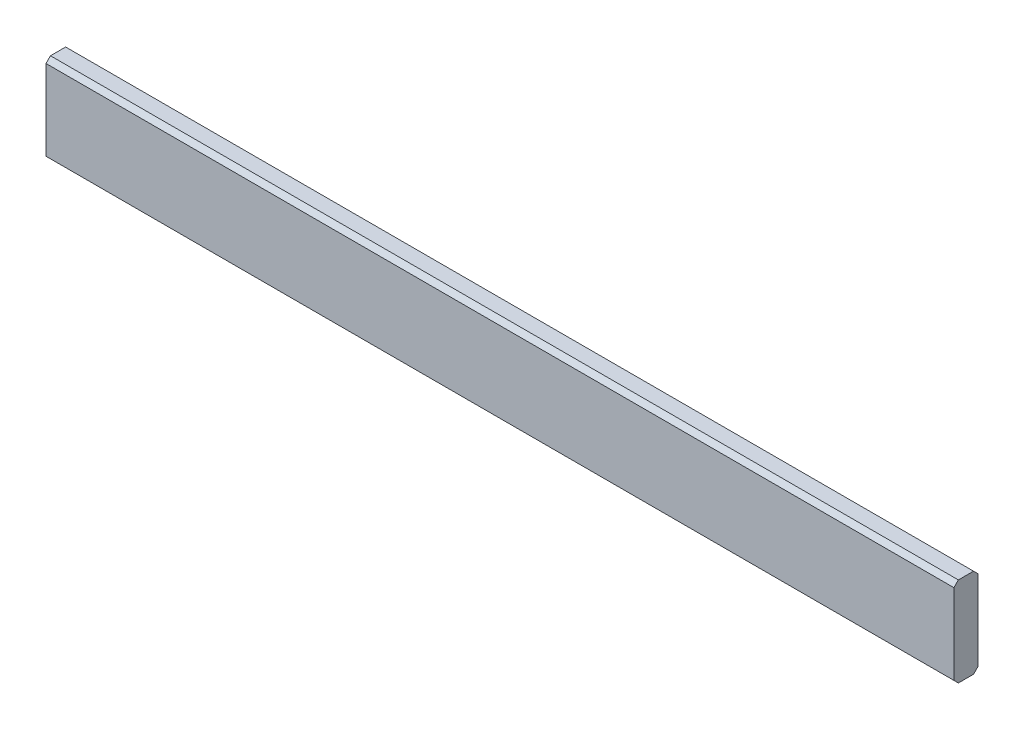
ISO-10303-21;
HEADER;
FILE_DESCRIPTION(('STEP AP214'),'2;1');
FILE_NAME('part.step','',(''),(''),'','','');
FILE_SCHEMA(('AUTOMOTIVE_DESIGN { 1 0 10303 214 1 1 1 1 }'));
ENDSEC;
DATA;
#1=APPLICATION_CONTEXT('core data for automotive mechanical design processes');
#2=APPLICATION_PROTOCOL_DEFINITION('international standard','automotive_design',2000,#1);
#3=PRODUCT_CONTEXT('',#1,'mechanical');
#4=PRODUCT('Part','Part','',(#3));
#5=PRODUCT_RELATED_PRODUCT_CATEGORY('part','',(#4));
#6=PRODUCT_DEFINITION_FORMATION('','',#4);
#7=PRODUCT_DEFINITION_CONTEXT('part definition',#1,'design');
#8=PRODUCT_DEFINITION('design','',#6,#7);
#9=PRODUCT_DEFINITION_SHAPE('','',#8);
#10=(LENGTH_UNIT() NAMED_UNIT(*) SI_UNIT(.MILLI.,.METRE.));
#11=(NAMED_UNIT(*) PLANE_ANGLE_UNIT() SI_UNIT($,.RADIAN.));
#12=(NAMED_UNIT(*) SI_UNIT($,.STERADIAN.) SOLID_ANGLE_UNIT());
#13=UNCERTAINTY_MEASURE_WITH_UNIT(LENGTH_MEASURE(1.E-05),#10,'distance_accuracy_value','');
#14=(GEOMETRIC_REPRESENTATION_CONTEXT(3) GLOBAL_UNCERTAINTY_ASSIGNED_CONTEXT((#13)) GLOBAL_UNIT_ASSIGNED_CONTEXT((#10,
#11,#12)) REPRESENTATION_CONTEXT('',''));
#15=CARTESIAN_POINT('',(0.,0.,0.));
#16=DIRECTION('',(0.,0.,1.));
#17=DIRECTION('',(1.,0.,0.));
#18=AXIS2_PLACEMENT_3D('',#15,#16,#17);
#19=CARTESIAN_POINT('',(0.,0.,27.));
#20=DIRECTION('',(1.,0.,0.));
#21=DIRECTION('',(0.,0.,-1.));
#22=AXIS2_PLACEMENT_3D('',#19,#20,#21);
#23=PLANE('',#22);
#24=DIRECTION('',(0.,-1.,0.));
#25=VECTOR('',#24,1.);
#26=CARTESIAN_POINT('',(0.,0.,0.));
#27=LINE('',#26,#25);
#28=CARTESIAN_POINT('',(0.,95.,0.));
#29=VERTEX_POINT('',#28);
#30=CARTESIAN_POINT('',(0.,5.,0.));
#31=VERTEX_POINT('',#30);
#32=EDGE_CURVE('E170',#29,#31,#27,.T.);
#33=ORIENTED_EDGE('',*,*,#32,.T.);
#34=DIRECTION('',(0.,-0.707106781186548,0.707106781186548));
#35=VECTOR('',#34,1.);
#36=CARTESIAN_POINT('',(0.,0.,5.));
#37=LINE('',#36,#35);
#38=CARTESIAN_POINT('',(0.,0.,5.));
#39=VERTEX_POINT('',#38);
#40=EDGE_CURVE('E144',#31,#39,#37,.T.);
#41=ORIENTED_EDGE('',*,*,#40,.T.);
#42=DIRECTION('',(0.,0.,-1.));
#43=VECTOR('',#42,1.);
#44=CARTESIAN_POINT('',(0.,0.,27.));
#45=LINE('',#44,#43);
#46=CARTESIAN_POINT('',(0.,0.,22.));
#47=VERTEX_POINT('',#46);
#48=EDGE_CURVE('E123',#47,#39,#45,.T.);
#49=ORIENTED_EDGE('',*,*,#48,.F.);
#50=DIRECTION('',(0.,-0.707106781186548,-0.707106781186548));
#51=VECTOR('',#50,1.);
#52=CARTESIAN_POINT('',(0.,5.,27.));
#53=LINE('',#52,#51);
#54=CARTESIAN_POINT('',(0.,5.,27.));
#55=VERTEX_POINT('',#54);
#56=EDGE_CURVE('E128',#47,#55,#53,.F.);
#57=ORIENTED_EDGE('',*,*,#56,.T.);
#58=DIRECTION('',(0.,-1.,0.));
#59=VECTOR('',#58,1.);
#60=CARTESIAN_POINT('',(0.,0.,27.));
#61=LINE('',#60,#59);
#62=CARTESIAN_POINT('',(0.,95.,27.));
#63=VERTEX_POINT('',#62);
#64=EDGE_CURVE('E165',#63,#55,#61,.T.);
#65=ORIENTED_EDGE('',*,*,#64,.F.);
#66=DIRECTION('',(0.,-0.70710678118654,0.707106781186555));
#67=VECTOR('',#66,1.);
#68=CARTESIAN_POINT('',(0.,95.,27.));
#69=LINE('',#68,#67);
#70=CARTESIAN_POINT('',(0.,100.,21.9999999999999));
#71=VERTEX_POINT('',#70);
#72=EDGE_CURVE('E58',#63,#71,#69,.F.);
#73=ORIENTED_EDGE('',*,*,#72,.T.);
#74=DIRECTION('',(0.,0.,-1.));
#75=VECTOR('',#74,1.);
#76=CARTESIAN_POINT('',(0.,100.,27.));
#77=LINE('',#76,#75);
#78=CARTESIAN_POINT('',(0.,100.,5.));
#79=VERTEX_POINT('',#78);
#80=EDGE_CURVE('E155',#71,#79,#77,.T.);
#81=ORIENTED_EDGE('',*,*,#80,.T.);
#82=DIRECTION('',(0.,-0.707106781186548,-0.707106781186548));
#83=VECTOR('',#82,1.);
#84=CARTESIAN_POINT('',(0.,100.,5.));
#85=LINE('',#84,#83);
#86=EDGE_CURVE('E51',#79,#29,#85,.T.);
#87=ORIENTED_EDGE('',*,*,#86,.T.);
#88=EDGE_LOOP('',(#33,#41,#49,#57,#65,#73,#81,#87));
#89=FACE_BOUND('',#88,.T.);
#90=ADVANCED_FACE('F35',(#89),#23,.F.);
#91=CARTESIAN_POINT('',(0.,0.,27.));
#92=DIRECTION('',(0.,1.,0.));
#93=DIRECTION('',(0.,0.,1.));
#94=AXIS2_PLACEMENT_3D('',#91,#92,#93);
#95=PLANE('',#94);
#96=ORIENTED_EDGE('',*,*,#48,.T.);
#97=DIRECTION('',(1.,0.,0.));
#98=VECTOR('',#97,1.);
#99=CARTESIAN_POINT('',(1017.,0.,5.));
#100=LINE('',#99,#98);
#101=CARTESIAN_POINT('',(1017.,0.,5.));
#102=VERTEX_POINT('',#101);
#103=EDGE_CURVE('E122',#39,#102,#100,.T.);
#104=ORIENTED_EDGE('',*,*,#103,.T.);
#105=DIRECTION('',(0.,0.,-1.));
#106=VECTOR('',#105,1.);
#107=CARTESIAN_POINT('',(1017.,0.,27.));
#108=LINE('',#107,#106);
#109=CARTESIAN_POINT('',(1017.,0.,22.));
#110=VERTEX_POINT('',#109);
#111=EDGE_CURVE('E105',#110,#102,#108,.T.);
#112=ORIENTED_EDGE('',*,*,#111,.F.);
#113=DIRECTION('',(-1.,0.,0.));
#114=VECTOR('',#113,1.);
#115=CARTESIAN_POINT('',(0.,0.,22.));
#116=LINE('',#115,#114);
#117=EDGE_CURVE('E119',#110,#47,#116,.T.);
#118=ORIENTED_EDGE('',*,*,#117,.T.);
#119=EDGE_LOOP('',(#96,#104,#112,#118));
#120=FACE_BOUND('',#119,.T.);
#121=ADVANCED_FACE('F118',(#120),#95,.F.);
#122=CARTESIAN_POINT('',(1017.,0.,27.));
#123=DIRECTION('',(-1.,0.,0.));
#124=DIRECTION('',(0.,0.,1.));
#125=AXIS2_PLACEMENT_3D('',#122,#123,#124);
#126=PLANE('',#125);
#127=ORIENTED_EDGE('',*,*,#111,.T.);
#128=DIRECTION('',(0.,0.707106781186548,-0.707106781186548));
#129=VECTOR('',#128,1.);
#130=CARTESIAN_POINT('',(1017.,0.,5.));
#131=LINE('',#130,#129);
#132=CARTESIAN_POINT('',(1017.,5.,0.));
#133=VERTEX_POINT('',#132);
#134=EDGE_CURVE('E112',#102,#133,#131,.T.);
#135=ORIENTED_EDGE('',*,*,#134,.T.);
#136=DIRECTION('',(0.,1.,0.));
#137=VECTOR('',#136,1.);
#138=CARTESIAN_POINT('',(1017.,0.,0.));
#139=LINE('',#138,#137);
#140=CARTESIAN_POINT('',(1017.,95.,0.));
#141=VERTEX_POINT('',#140);
#142=EDGE_CURVE('E167',#133,#141,#139,.T.);
#143=ORIENTED_EDGE('',*,*,#142,.T.);
#144=DIRECTION('',(0.,0.707106781186548,0.707106781186548));
#145=VECTOR('',#144,1.);
#146=CARTESIAN_POINT('',(1017.,100.,5.));
#147=LINE('',#146,#145);
#148=CARTESIAN_POINT('',(1017.,100.,5.));
#149=VERTEX_POINT('',#148);
#150=EDGE_CURVE('E113',#141,#149,#147,.T.);
#151=ORIENTED_EDGE('',*,*,#150,.T.);
#152=DIRECTION('',(0.,0.,-1.));
#153=VECTOR('',#152,1.);
#154=CARTESIAN_POINT('',(1017.,100.,27.));
#155=LINE('',#154,#153);
#156=CARTESIAN_POINT('',(1017.,100.,21.9999999999999));
#157=VERTEX_POINT('',#156);
#158=EDGE_CURVE('E124',#157,#149,#155,.T.);
#159=ORIENTED_EDGE('',*,*,#158,.F.);
#160=DIRECTION('',(0.,0.70710678118654,-0.707106781186555));
#161=VECTOR('',#160,1.);
#162=CARTESIAN_POINT('',(1017.,95.,27.));
#163=LINE('',#162,#161);
#164=CARTESIAN_POINT('',(1017.,95.,27.));
#165=VERTEX_POINT('',#164);
#166=EDGE_CURVE('E130',#157,#165,#163,.F.);
#167=ORIENTED_EDGE('',*,*,#166,.T.);
#168=DIRECTION('',(0.,1.,0.));
#169=VECTOR('',#168,1.);
#170=CARTESIAN_POINT('',(1017.,0.,27.));
#171=LINE('',#170,#169);
#172=CARTESIAN_POINT('',(1017.,5.,27.));
#173=VERTEX_POINT('',#172);
#174=EDGE_CURVE('E107',#173,#165,#171,.T.);
#175=ORIENTED_EDGE('',*,*,#174,.F.);
#176=DIRECTION('',(0.,0.707106781186548,0.707106781186548));
#177=VECTOR('',#176,1.);
#178=CARTESIAN_POINT('',(1017.,5.,27.));
#179=LINE('',#178,#177);
#180=EDGE_CURVE('E102',#173,#110,#179,.F.);
#181=ORIENTED_EDGE('',*,*,#180,.T.);
#182=EDGE_LOOP('',(#127,#135,#143,#151,#159,#167,#175,#181));
#183=FACE_BOUND('',#182,.T.);
#184=ADVANCED_FACE('F104',(#183),#126,.F.);
#185=CARTESIAN_POINT('',(0.,100.,27.));
#186=DIRECTION('',(0.,-1.,0.));
#187=DIRECTION('',(0.,0.,-1.));
#188=AXIS2_PLACEMENT_3D('',#185,#186,#187);
#189=PLANE('',#188);
#190=ORIENTED_EDGE('',*,*,#158,.T.);
#191=DIRECTION('',(-1.,0.,0.));
#192=VECTOR('',#191,1.);
#193=CARTESIAN_POINT('',(0.,100.,5.));
#194=LINE('',#193,#192);
#195=EDGE_CURVE('E11',#149,#79,#194,.T.);
#196=ORIENTED_EDGE('',*,*,#195,.T.);
#197=ORIENTED_EDGE('',*,*,#80,.F.);
#198=DIRECTION('',(1.,0.,0.));
#199=VECTOR('',#198,1.);
#200=CARTESIAN_POINT('',(0.,100.,21.9999999999999));
#201=LINE('',#200,#199);
#202=EDGE_CURVE('E44',#71,#157,#201,.T.);
#203=ORIENTED_EDGE('',*,*,#202,.T.);
#204=EDGE_LOOP('',(#190,#196,#197,#203));
#205=FACE_BOUND('',#204,.T.);
#206=ADVANCED_FACE('F154',(#205),#189,.F.);
#207=CARTESIAN_POINT('',(0.,0.,27.));
#208=DIRECTION('',(0.,0.,-1.));
#209=DIRECTION('',(-1.,0.,0.));
#210=AXIS2_PLACEMENT_3D('',#207,#208,#209);
#211=PLANE('',#210);
#212=ORIENTED_EDGE('',*,*,#64,.T.);
#213=DIRECTION('',(1.,0.,0.));
#214=VECTOR('',#213,1.);
#215=CARTESIAN_POINT('',(0.,5.,27.));
#216=LINE('',#215,#214);
#217=EDGE_CURVE('E149',#55,#173,#216,.T.);
#218=ORIENTED_EDGE('',*,*,#217,.T.);
#219=ORIENTED_EDGE('',*,*,#174,.T.);
#220=DIRECTION('',(-1.,0.,0.));
#221=VECTOR('',#220,1.);
#222=CARTESIAN_POINT('',(0.,95.,27.));
#223=LINE('',#222,#221);
#224=EDGE_CURVE('E146',#165,#63,#223,.T.);
#225=ORIENTED_EDGE('',*,*,#224,.T.);
#226=EDGE_LOOP('',(#212,#218,#219,#225));
#227=FACE_BOUND('',#226,.T.);
#228=ADVANCED_FACE('F164',(#227),#211,.F.);
#229=CARTESIAN_POINT('',(0.,0.,0.));
#230=DIRECTION('',(0.,0.,-1.));
#231=DIRECTION('',(-1.,0.,0.));
#232=AXIS2_PLACEMENT_3D('',#229,#230,#231);
#233=PLANE('',#232);
#234=ORIENTED_EDGE('',*,*,#142,.F.);
#235=DIRECTION('',(-1.,0.,0.));
#236=VECTOR('',#235,1.);
#237=CARTESIAN_POINT('',(0.,5.,0.));
#238=LINE('',#237,#236);
#239=EDGE_CURVE('E139',#133,#31,#238,.T.);
#240=ORIENTED_EDGE('',*,*,#239,.T.);
#241=ORIENTED_EDGE('',*,*,#32,.F.);
#242=DIRECTION('',(1.,0.,0.));
#243=VECTOR('',#242,1.);
#244=CARTESIAN_POINT('',(1017.,95.,0.));
#245=LINE('',#244,#243);
#246=EDGE_CURVE('E137',#29,#141,#245,.T.);
#247=ORIENTED_EDGE('',*,*,#246,.T.);
#248=EDGE_LOOP('',(#234,#240,#241,#247));
#249=FACE_BOUND('',#248,.T.);
#250=ADVANCED_FACE('F178',(#249),#233,.T.);
#251=CARTESIAN_POINT('',(0.,0.,5.));
#252=DIRECTION('',(0.,-0.707106781186547,-0.707106781186547));
#253=DIRECTION('',(-1.,0.,0.));
#254=AXIS2_PLACEMENT_3D('',#251,#252,#253);
#255=PLANE('',#254);
#256=ORIENTED_EDGE('',*,*,#40,.F.);
#257=ORIENTED_EDGE('',*,*,#239,.F.);
#258=ORIENTED_EDGE('',*,*,#134,.F.);
#259=ORIENTED_EDGE('',*,*,#103,.F.);
#260=EDGE_LOOP('',(#256,#257,#258,#259));
#261=FACE_BOUND('',#260,.T.);
#262=ADVANCED_FACE('F186',(#261),#255,.T.);
#263=CARTESIAN_POINT('',(0.,5.,27.));
#264=DIRECTION('',(0.,0.707106781186547,-0.707106781186547));
#265=DIRECTION('',(1.,0.,0.));
#266=AXIS2_PLACEMENT_3D('',#263,#264,#265);
#267=PLANE('',#266);
#268=ORIENTED_EDGE('',*,*,#56,.F.);
#269=ORIENTED_EDGE('',*,*,#117,.F.);
#270=ORIENTED_EDGE('',*,*,#180,.F.);
#271=ORIENTED_EDGE('',*,*,#217,.F.);
#272=EDGE_LOOP('',(#268,#269,#270,#271));
#273=FACE_BOUND('',#272,.T.);
#274=ADVANCED_FACE('F127',(#273),#267,.F.);
#275=CARTESIAN_POINT('',(0.,100.,5.));
#276=DIRECTION('',(0.,0.707106781186547,-0.707106781186547));
#277=DIRECTION('',(1.,0.,0.));
#278=AXIS2_PLACEMENT_3D('',#275,#276,#277);
#279=PLANE('',#278);
#280=ORIENTED_EDGE('',*,*,#150,.F.);
#281=ORIENTED_EDGE('',*,*,#246,.F.);
#282=ORIENTED_EDGE('',*,*,#86,.F.);
#283=ORIENTED_EDGE('',*,*,#195,.F.);
#284=EDGE_LOOP('',(#280,#281,#282,#283));
#285=FACE_BOUND('',#284,.T.);
#286=ADVANCED_FACE('F180',(#285),#279,.T.);
#287=CARTESIAN_POINT('',(0.,95.,27.));
#288=DIRECTION('',(0.,-0.707106781186555,-0.70710678118654));
#289=DIRECTION('',(-1.,0.,0.));
#290=AXIS2_PLACEMENT_3D('',#287,#288,#289);
#291=PLANE('',#290);
#292=ORIENTED_EDGE('',*,*,#166,.F.);
#293=ORIENTED_EDGE('',*,*,#202,.F.);
#294=ORIENTED_EDGE('',*,*,#72,.F.);
#295=ORIENTED_EDGE('',*,*,#224,.F.);
#296=EDGE_LOOP('',(#292,#293,#294,#295));
#297=FACE_BOUND('',#296,.T.);
#298=ADVANCED_FACE('F38',(#297),#291,.F.);
#299=CLOSED_SHELL('',(#90,#121,#184,#206,#228,#250,#262,#274,#286,#298));
#300=MANIFOLD_SOLID_BREP('B2',#299);
#301=ADVANCED_BREP_SHAPE_REPRESENTATION('',(#18,#300),#14);
#302=SHAPE_DEFINITION_REPRESENTATION(#9,#301);
ENDSEC;
END-ISO-10303-21;
